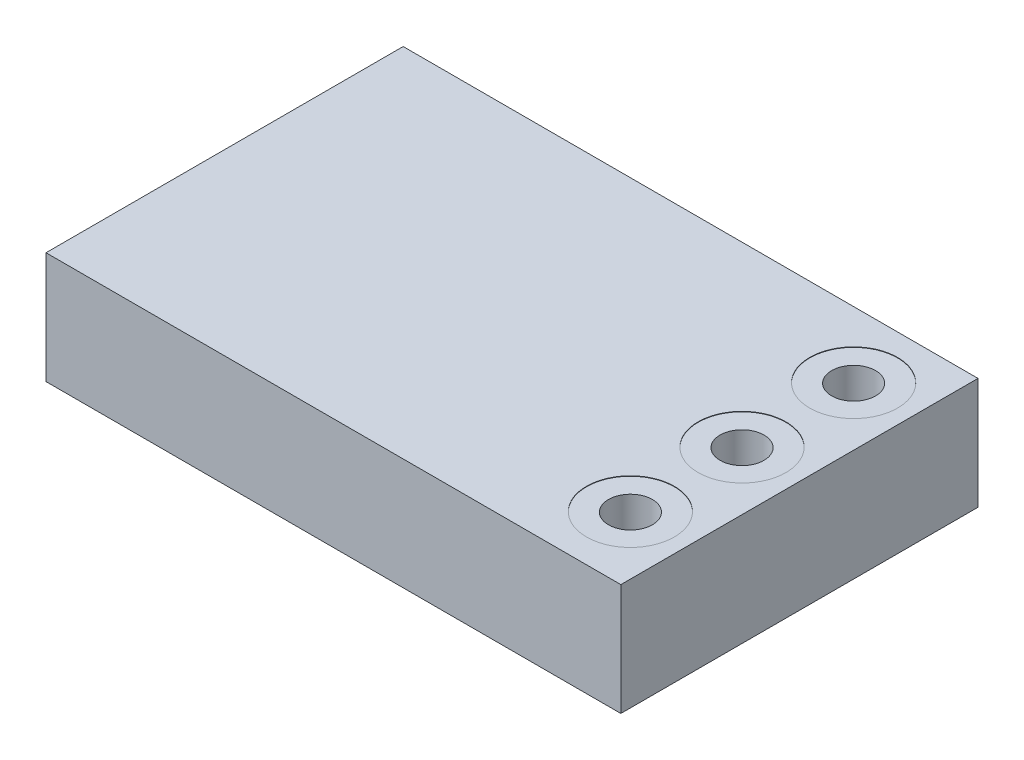
ISO-10303-21;
HEADER;
FILE_DESCRIPTION(('STEP AP214'),'2;1');
FILE_NAME('part.step','',(''),(''),'','','');
FILE_SCHEMA(('AUTOMOTIVE_DESIGN { 1 0 10303 214 1 1 1 1 }'));
ENDSEC;
DATA;
#1=APPLICATION_CONTEXT('core data for automotive mechanical design processes');
#2=APPLICATION_PROTOCOL_DEFINITION('international standard','automotive_design',2000,#1);
#3=PRODUCT_CONTEXT('',#1,'mechanical');
#4=PRODUCT('Part','Part','',(#3));
#5=PRODUCT_RELATED_PRODUCT_CATEGORY('part','',(#4));
#6=PRODUCT_DEFINITION_FORMATION('','',#4);
#7=PRODUCT_DEFINITION_CONTEXT('part definition',#1,'design');
#8=PRODUCT_DEFINITION('design','',#6,#7);
#9=PRODUCT_DEFINITION_SHAPE('','',#8);
#10=(LENGTH_UNIT() NAMED_UNIT(*) SI_UNIT(.MILLI.,.METRE.));
#11=(NAMED_UNIT(*) PLANE_ANGLE_UNIT() SI_UNIT($,.RADIAN.));
#12=(NAMED_UNIT(*) SI_UNIT($,.STERADIAN.) SOLID_ANGLE_UNIT());
#13=UNCERTAINTY_MEASURE_WITH_UNIT(LENGTH_MEASURE(1.E-05),#10,'distance_accuracy_value','');
#14=(GEOMETRIC_REPRESENTATION_CONTEXT(3) GLOBAL_UNCERTAINTY_ASSIGNED_CONTEXT((#13)) GLOBAL_UNIT_ASSIGNED_CONTEXT((#10,
#11,#12)) REPRESENTATION_CONTEXT('',''));
#15=CARTESIAN_POINT('',(0.,0.,0.));
#16=DIRECTION('',(0.,0.,1.));
#17=DIRECTION('',(1.,0.,0.));
#18=AXIS2_PLACEMENT_3D('',#15,#16,#17);
#19=CARTESIAN_POINT('',(5.2112978071614,0.,2.51672815499874));
#20=DIRECTION('',(0.,1.,0.));
#21=DIRECTION('',(0.,0.,1.));
#22=AXIS2_PLACEMENT_3D('',#19,#20,#21);
#23=CYLINDRICAL_SURFACE('',#22,0.500000000000001);
#24=CARTESIAN_POINT('',(5.2112978071614,0.,2.51672815499874));
#25=DIRECTION('',(0.,1.,0.));
#26=DIRECTION('',(0.,0.,1.));
#27=AXIS2_PLACEMENT_3D('',#24,#25,#26);
#28=CIRCLE('',#27,0.500000000000001);
#29=CARTESIAN_POINT('',(5.2112978071614,0.,3.01672815499874));
#30=VERTEX_POINT('',#29);
#31=EDGE_CURVE('E115',#30,#30,#28,.T.);
#32=ORIENTED_EDGE('',*,*,#31,.F.);
#33=EDGE_LOOP('',(#32));
#34=FACE_BOUND('',#33,.T.);
#35=CARTESIAN_POINT('',(5.2112978071614,2.53,2.51672815499874));
#36=DIRECTION('',(0.,1.,0.));
#37=DIRECTION('',(0.,0.,1.));
#38=AXIS2_PLACEMENT_3D('',#35,#36,#37);
#39=CIRCLE('',#38,0.500000000000001);
#40=CARTESIAN_POINT('',(5.2112978071614,2.53,3.01672815499874));
#41=VERTEX_POINT('',#40);
#42=EDGE_CURVE('E41',#41,#41,#39,.F.);
#43=ORIENTED_EDGE('',*,*,#42,.F.);
#44=EDGE_LOOP('',(#43));
#45=FACE_BOUND('',#44,.T.);
#46=ADVANCED_FACE('F37',(#34,#45),#23,.F.);
#47=CARTESIAN_POINT('',(5.2112978071614,0.,-0.0232718450012578));
#48=DIRECTION('',(0.,1.,0.));
#49=DIRECTION('',(0.,0.,1.));
#50=AXIS2_PLACEMENT_3D('',#47,#48,#49);
#51=CYLINDRICAL_SURFACE('',#50,0.500000000000001);
#52=CARTESIAN_POINT('',(5.2112978071614,0.,-0.0232718450012578));
#53=DIRECTION('',(0.,1.,0.));
#54=DIRECTION('',(0.,0.,1.));
#55=AXIS2_PLACEMENT_3D('',#52,#53,#54);
#56=CIRCLE('',#55,0.500000000000001);
#57=CARTESIAN_POINT('',(5.2112978071614,0.,0.476728154998743));
#58=VERTEX_POINT('',#57);
#59=EDGE_CURVE('E140',#58,#58,#56,.T.);
#60=ORIENTED_EDGE('',*,*,#59,.F.);
#61=EDGE_LOOP('',(#60));
#62=FACE_BOUND('',#61,.T.);
#63=CARTESIAN_POINT('',(5.2112978071614,2.53,-0.0232718450012578));
#64=DIRECTION('',(0.,1.,0.));
#65=DIRECTION('',(0.,0.,1.));
#66=AXIS2_PLACEMENT_3D('',#63,#64,#65);
#67=CIRCLE('',#66,0.500000000000001);
#68=CARTESIAN_POINT('',(5.2112978071614,2.53,0.476728154998743));
#69=VERTEX_POINT('',#68);
#70=EDGE_CURVE('E117',#69,#69,#67,.F.);
#71=ORIENTED_EDGE('',*,*,#70,.F.);
#72=EDGE_LOOP('',(#71));
#73=FACE_BOUND('',#72,.T.);
#74=ADVANCED_FACE('F152',(#62,#73),#51,.F.);
#75=CARTESIAN_POINT('',(5.2112978071614,0.,-2.56327184500126));
#76=DIRECTION('',(0.,1.,0.));
#77=DIRECTION('',(0.,0.,1.));
#78=AXIS2_PLACEMENT_3D('',#75,#76,#77);
#79=CYLINDRICAL_SURFACE('',#78,0.500000000000001);
#80=CARTESIAN_POINT('',(5.2112978071614,0.,-2.56327184500126));
#81=DIRECTION('',(0.,1.,0.));
#82=DIRECTION('',(0.,0.,1.));
#83=AXIS2_PLACEMENT_3D('',#80,#81,#82);
#84=CIRCLE('',#83,0.500000000000001);
#85=CARTESIAN_POINT('',(5.2112978071614,0.,-2.06327184500126));
#86=VERTEX_POINT('',#85);
#87=EDGE_CURVE('E107',#86,#86,#84,.T.);
#88=ORIENTED_EDGE('',*,*,#87,.F.);
#89=EDGE_LOOP('',(#88));
#90=FACE_BOUND('',#89,.T.);
#91=CARTESIAN_POINT('',(5.2112978071614,2.53,-2.56327184500126));
#92=DIRECTION('',(0.,1.,0.));
#93=DIRECTION('',(0.,0.,1.));
#94=AXIS2_PLACEMENT_3D('',#91,#92,#93);
#95=CIRCLE('',#94,0.500000000000001);
#96=CARTESIAN_POINT('',(5.2112978071614,2.53,-2.06327184500126));
#97=VERTEX_POINT('',#96);
#98=EDGE_CURVE('E113',#97,#97,#95,.F.);
#99=ORIENTED_EDGE('',*,*,#98,.F.);
#100=EDGE_LOOP('',(#99));
#101=FACE_BOUND('',#100,.T.);
#102=ADVANCED_FACE('F149',(#90,#101),#79,.F.);
#103=CARTESIAN_POINT('',(6.5405,2.54,4.064));
#104=DIRECTION('',(-1.,0.,0.));
#105=DIRECTION('',(0.,0.,1.));
#106=AXIS2_PLACEMENT_3D('',#103,#104,#105);
#107=PLANE('',#106);
#108=DIRECTION('',(0.,0.,-1.));
#109=VECTOR('',#108,1.);
#110=CARTESIAN_POINT('',(6.5405,0.,4.064));
#111=LINE('',#110,#109);
#112=CARTESIAN_POINT('',(6.5405,0.,4.064));
#113=VERTEX_POINT('',#112);
#114=CARTESIAN_POINT('',(6.5405,0.,-4.064));
#115=VERTEX_POINT('',#114);
#116=EDGE_CURVE('E104',#113,#115,#111,.T.);
#117=ORIENTED_EDGE('',*,*,#116,.T.);
#118=DIRECTION('',(0.,-1.,0.));
#119=VECTOR('',#118,1.);
#120=CARTESIAN_POINT('',(6.5405,2.54,-4.064));
#121=LINE('',#120,#119);
#122=CARTESIAN_POINT('',(6.5405,2.54,-4.064));
#123=VERTEX_POINT('',#122);
#124=EDGE_CURVE('E11',#123,#115,#121,.T.);
#125=ORIENTED_EDGE('',*,*,#124,.F.);
#126=DIRECTION('',(0.,0.,-1.));
#127=VECTOR('',#126,1.);
#128=CARTESIAN_POINT('',(6.5405,2.54,4.064));
#129=LINE('',#128,#127);
#130=CARTESIAN_POINT('',(6.5405,2.54,4.064));
#131=VERTEX_POINT('',#130);
#132=EDGE_CURVE('E91',#131,#123,#129,.T.);
#133=ORIENTED_EDGE('',*,*,#132,.F.);
#134=DIRECTION('',(0.,-1.,0.));
#135=VECTOR('',#134,1.);
#136=CARTESIAN_POINT('',(6.5405,2.54,4.064));
#137=LINE('',#136,#135);
#138=EDGE_CURVE('E100',#131,#113,#137,.T.);
#139=ORIENTED_EDGE('',*,*,#138,.T.);
#140=EDGE_LOOP('',(#117,#125,#133,#139));
#141=FACE_BOUND('',#140,.T.);
#142=ADVANCED_FACE('F39',(#141),#107,.F.);
#143=CARTESIAN_POINT('',(-6.5405,2.54,-4.064));
#144=DIRECTION('',(0.,0.,1.));
#145=DIRECTION('',(1.,0.,0.));
#146=AXIS2_PLACEMENT_3D('',#143,#144,#145);
#147=PLANE('',#146);
#148=DIRECTION('',(-1.,0.,0.));
#149=VECTOR('',#148,1.);
#150=CARTESIAN_POINT('',(-6.5405,0.,-4.064));
#151=LINE('',#150,#149);
#152=CARTESIAN_POINT('',(-6.5405,0.,-4.064));
#153=VERTEX_POINT('',#152);
#154=EDGE_CURVE('E95',#115,#153,#151,.T.);
#155=ORIENTED_EDGE('',*,*,#154,.T.);
#156=DIRECTION('',(0.,-1.,0.));
#157=VECTOR('',#156,1.);
#158=CARTESIAN_POINT('',(-6.5405,2.54,-4.064));
#159=LINE('',#158,#157);
#160=CARTESIAN_POINT('',(-6.5405,2.54,-4.064));
#161=VERTEX_POINT('',#160);
#162=EDGE_CURVE('E47',#161,#153,#159,.T.);
#163=ORIENTED_EDGE('',*,*,#162,.F.);
#164=DIRECTION('',(-1.,0.,0.));
#165=VECTOR('',#164,1.);
#166=CARTESIAN_POINT('',(-6.5405,2.54,-4.064));
#167=LINE('',#166,#165);
#168=EDGE_CURVE('E86',#123,#161,#167,.T.);
#169=ORIENTED_EDGE('',*,*,#168,.F.);
#170=ORIENTED_EDGE('',*,*,#124,.T.);
#171=EDGE_LOOP('',(#155,#163,#169,#170));
#172=FACE_BOUND('',#171,.T.);
#173=ADVANCED_FACE('F94',(#172),#147,.F.);
#174=CARTESIAN_POINT('',(-6.5405,2.54,4.064));
#175=DIRECTION('',(1.,0.,0.));
#176=DIRECTION('',(0.,0.,-1.));
#177=AXIS2_PLACEMENT_3D('',#174,#175,#176);
#178=PLANE('',#177);
#179=DIRECTION('',(0.,0.,1.));
#180=VECTOR('',#179,1.);
#181=CARTESIAN_POINT('',(-6.5405,0.,4.064));
#182=LINE('',#181,#180);
#183=CARTESIAN_POINT('',(-6.5405,0.,4.064));
#184=VERTEX_POINT('',#183);
#185=EDGE_CURVE('E73',#153,#184,#182,.T.);
#186=ORIENTED_EDGE('',*,*,#185,.T.);
#187=DIRECTION('',(0.,-1.,0.));
#188=VECTOR('',#187,1.);
#189=CARTESIAN_POINT('',(-6.5405,2.54,4.064));
#190=LINE('',#189,#188);
#191=CARTESIAN_POINT('',(-6.5405,2.54,4.064));
#192=VERTEX_POINT('',#191);
#193=EDGE_CURVE('E96',#192,#184,#190,.T.);
#194=ORIENTED_EDGE('',*,*,#193,.F.);
#195=DIRECTION('',(0.,0.,1.));
#196=VECTOR('',#195,1.);
#197=CARTESIAN_POINT('',(-6.5405,2.54,4.064));
#198=LINE('',#197,#196);
#199=EDGE_CURVE('E89',#161,#192,#198,.T.);
#200=ORIENTED_EDGE('',*,*,#199,.F.);
#201=ORIENTED_EDGE('',*,*,#162,.T.);
#202=EDGE_LOOP('',(#186,#194,#200,#201));
#203=FACE_BOUND('',#202,.T.);
#204=ADVANCED_FACE('F98',(#203),#178,.F.);
#205=CARTESIAN_POINT('',(-6.5405,2.54,4.064));
#206=DIRECTION('',(0.,0.,-1.));
#207=DIRECTION('',(-1.,0.,0.));
#208=AXIS2_PLACEMENT_3D('',#205,#206,#207);
#209=PLANE('',#208);
#210=DIRECTION('',(1.,0.,0.));
#211=VECTOR('',#210,1.);
#212=CARTESIAN_POINT('',(-6.5405,0.,4.064));
#213=LINE('',#212,#211);
#214=EDGE_CURVE('E79',#184,#113,#213,.T.);
#215=ORIENTED_EDGE('',*,*,#214,.T.);
#216=ORIENTED_EDGE('',*,*,#138,.F.);
#217=DIRECTION('',(1.,0.,0.));
#218=VECTOR('',#217,1.);
#219=CARTESIAN_POINT('',(-6.5405,2.54,4.064));
#220=LINE('',#219,#218);
#221=EDGE_CURVE('E56',#192,#131,#220,.T.);
#222=ORIENTED_EDGE('',*,*,#221,.F.);
#223=ORIENTED_EDGE('',*,*,#193,.T.);
#224=EDGE_LOOP('',(#215,#216,#222,#223));
#225=FACE_BOUND('',#224,.T.);
#226=ADVANCED_FACE('F184',(#225),#209,.F.);
#227=CARTESIAN_POINT('',(0.,2.54,0.));
#228=DIRECTION('',(0.,-1.,0.));
#229=DIRECTION('',(0.,0.,-1.));
#230=AXIS2_PLACEMENT_3D('',#227,#228,#229);
#231=PLANE('',#230);
#232=CARTESIAN_POINT('',(5.2112978071614,2.54,2.51672815499874));
#233=DIRECTION('',(0.,1.,0.));
#234=DIRECTION('',(0.,0.,1.));
#235=AXIS2_PLACEMENT_3D('',#232,#233,#234);
#236=CIRCLE('',#235,1.);
#237=CARTESIAN_POINT('',(5.2112978071614,2.54,3.51672815499874));
#238=VERTEX_POINT('',#237);
#239=EDGE_CURVE('E133',#238,#238,#236,.T.);
#240=ORIENTED_EDGE('',*,*,#239,.F.);
#241=EDGE_LOOP('',(#240));
#242=FACE_BOUND('',#241,.T.);
#243=CARTESIAN_POINT('',(5.2112978071614,2.54,-0.0232718450012578));
#244=DIRECTION('',(0.,1.,0.));
#245=DIRECTION('',(0.,0.,1.));
#246=AXIS2_PLACEMENT_3D('',#243,#244,#245);
#247=CIRCLE('',#246,1.);
#248=CARTESIAN_POINT('',(5.2112978071614,2.54,0.976728154998742));
#249=VERTEX_POINT('',#248);
#250=EDGE_CURVE('E126',#249,#249,#247,.T.);
#251=ORIENTED_EDGE('',*,*,#250,.F.);
#252=EDGE_LOOP('',(#251));
#253=FACE_BOUND('',#252,.T.);
#254=CARTESIAN_POINT('',(5.2112978071614,2.54,-2.56327184500126));
#255=DIRECTION('',(0.,1.,0.));
#256=DIRECTION('',(0.,0.,1.));
#257=AXIS2_PLACEMENT_3D('',#254,#255,#256);
#258=CIRCLE('',#257,1.);
#259=CARTESIAN_POINT('',(5.2112978071614,2.54,-1.56327184500126));
#260=VERTEX_POINT('',#259);
#261=EDGE_CURVE('E119',#260,#260,#258,.T.);
#262=ORIENTED_EDGE('',*,*,#261,.F.);
#263=EDGE_LOOP('',(#262));
#264=FACE_BOUND('',#263,.T.);
#265=ORIENTED_EDGE('',*,*,#132,.T.);
#266=ORIENTED_EDGE('',*,*,#168,.T.);
#267=ORIENTED_EDGE('',*,*,#199,.T.);
#268=ORIENTED_EDGE('',*,*,#221,.T.);
#269=EDGE_LOOP('',(#265,#266,#267,#268));
#270=FACE_BOUND('',#269,.T.);
#271=ADVANCED_FACE('F87',(#242,#253,#264,#270),#231,.F.);
#272=CARTESIAN_POINT('',(0.,0.,0.));
#273=DIRECTION('',(0.,-1.,0.));
#274=DIRECTION('',(0.,0.,-1.));
#275=AXIS2_PLACEMENT_3D('',#272,#273,#274);
#276=PLANE('',#275);
#277=ORIENTED_EDGE('',*,*,#31,.T.);
#278=EDGE_LOOP('',(#277));
#279=FACE_BOUND('',#278,.T.);
#280=ORIENTED_EDGE('',*,*,#59,.T.);
#281=EDGE_LOOP('',(#280));
#282=FACE_BOUND('',#281,.T.);
#283=ORIENTED_EDGE('',*,*,#87,.T.);
#284=EDGE_LOOP('',(#283));
#285=FACE_BOUND('',#284,.T.);
#286=ORIENTED_EDGE('',*,*,#116,.F.);
#287=ORIENTED_EDGE('',*,*,#214,.F.);
#288=ORIENTED_EDGE('',*,*,#185,.F.);
#289=ORIENTED_EDGE('',*,*,#154,.F.);
#290=EDGE_LOOP('',(#286,#287,#288,#289));
#291=FACE_BOUND('',#290,.T.);
#292=ADVANCED_FACE('F146',(#279,#282,#285,#291),#276,.T.);
#293=CARTESIAN_POINT('',(5.2112978071614,2.53,-2.56327184500126));
#294=DIRECTION('',(0.,1.,0.));
#295=DIRECTION('',(0.,0.,1.));
#296=AXIS2_PLACEMENT_3D('',#293,#294,#295);
#297=PLANE('',#296);
#298=CARTESIAN_POINT('',(5.2112978071614,2.53,-2.56327184500126));
#299=DIRECTION('',(0.,1.,0.));
#300=DIRECTION('',(0.,0.,1.));
#301=AXIS2_PLACEMENT_3D('',#298,#299,#300);
#302=CIRCLE('',#301,1.);
#303=CARTESIAN_POINT('',(5.2112978071614,2.53,-1.56327184500126));
#304=VERTEX_POINT('',#303);
#305=EDGE_CURVE('E116',#304,#304,#302,.T.);
#306=ORIENTED_EDGE('',*,*,#305,.T.);
#307=EDGE_LOOP('',(#306));
#308=FACE_BOUND('',#307,.T.);
#309=ORIENTED_EDGE('',*,*,#98,.T.);
#310=EDGE_LOOP('',(#309));
#311=FACE_BOUND('',#310,.T.);
#312=ADVANCED_FACE('F156',(#308,#311),#297,.T.);
#313=CARTESIAN_POINT('',(5.2112978071614,2.53,-2.56327184500126));
#314=DIRECTION('',(0.,1.,0.));
#315=DIRECTION('',(0.,0.,1.));
#316=AXIS2_PLACEMENT_3D('',#313,#314,#315);
#317=CYLINDRICAL_SURFACE('',#316,1.);
#318=CARTESIAN_POINT('',(5.2112978071614,2.53,-1.56327184500126));
#319=CARTESIAN_POINT('',(5.2112978071614,2.53010416666667,-1.56327184500126));
#320=CARTESIAN_POINT('',(5.2112978071614,2.53020833333333,-1.56327184500126));
#321=CARTESIAN_POINT('',(5.2112978071614,2.53041666666667,-1.56327184500126));
#322=CARTESIAN_POINT('',(5.2112978071614,2.53052083333333,-1.56327184500126));
#323=CARTESIAN_POINT('',(5.2112978071614,2.53072916666667,-1.56327184500126));
#324=CARTESIAN_POINT('',(5.2112978071614,2.53083333333333,-1.56327184500126));
#325=CARTESIAN_POINT('',(5.2112978071614,2.53104166666667,-1.56327184500126));
#326=CARTESIAN_POINT('',(5.2112978071614,2.53114583333333,-1.56327184500126));
#327=CARTESIAN_POINT('',(5.2112978071614,2.53135416666667,-1.56327184500126));
#328=CARTESIAN_POINT('',(5.2112978071614,2.53145833333333,-1.56327184500126));
#329=CARTESIAN_POINT('',(5.2112978071614,2.53166666666667,-1.56327184500126));
#330=CARTESIAN_POINT('',(5.2112978071614,2.53177083333333,-1.56327184500126));
#331=CARTESIAN_POINT('',(5.2112978071614,2.53197916666667,-1.56327184500126));
#332=CARTESIAN_POINT('',(5.2112978071614,2.53208333333333,-1.56327184500126));
#333=CARTESIAN_POINT('',(5.2112978071614,2.53229166666667,-1.56327184500126));
#334=CARTESIAN_POINT('',(5.2112978071614,2.53239583333333,-1.56327184500126));
#335=CARTESIAN_POINT('',(5.2112978071614,2.53260416666667,-1.56327184500126));
#336=CARTESIAN_POINT('',(5.2112978071614,2.53270833333333,-1.56327184500126));
#337=CARTESIAN_POINT('',(5.2112978071614,2.53291666666667,-1.56327184500126));
#338=CARTESIAN_POINT('',(5.2112978071614,2.53302083333333,-1.56327184500126));
#339=CARTESIAN_POINT('',(5.2112978071614,2.53322916666667,-1.56327184500126));
#340=CARTESIAN_POINT('',(5.2112978071614,2.53333333333333,-1.56327184500126));
#341=CARTESIAN_POINT('',(5.2112978071614,2.53354166666667,-1.56327184500126));
#342=CARTESIAN_POINT('',(5.2112978071614,2.53364583333333,-1.56327184500126));
#343=CARTESIAN_POINT('',(5.2112978071614,2.53385416666667,-1.56327184500126));
#344=CARTESIAN_POINT('',(5.2112978071614,2.53395833333333,-1.56327184500126));
#345=CARTESIAN_POINT('',(5.2112978071614,2.53416666666667,-1.56327184500126));
#346=CARTESIAN_POINT('',(5.2112978071614,2.53427083333333,-1.56327184500126));
#347=CARTESIAN_POINT('',(5.2112978071614,2.53447916666667,-1.56327184500126));
#348=CARTESIAN_POINT('',(5.2112978071614,2.53458333333333,-1.56327184500126));
#349=CARTESIAN_POINT('',(5.2112978071614,2.53479166666667,-1.56327184500126));
#350=CARTESIAN_POINT('',(5.2112978071614,2.53489583333333,-1.56327184500126));
#351=CARTESIAN_POINT('',(5.2112978071614,2.53510416666667,-1.56327184500126));
#352=CARTESIAN_POINT('',(5.2112978071614,2.53520833333333,-1.56327184500126));
#353=CARTESIAN_POINT('',(5.2112978071614,2.53541666666667,-1.56327184500126));
#354=CARTESIAN_POINT('',(5.2112978071614,2.53552083333333,-1.56327184500126));
#355=CARTESIAN_POINT('',(5.2112978071614,2.53572916666667,-1.56327184500126));
#356=CARTESIAN_POINT('',(5.2112978071614,2.53583333333333,-1.56327184500126));
#357=CARTESIAN_POINT('',(5.2112978071614,2.53604166666667,-1.56327184500126));
#358=CARTESIAN_POINT('',(5.2112978071614,2.53614583333333,-1.56327184500126));
#359=CARTESIAN_POINT('',(5.2112978071614,2.53635416666667,-1.56327184500126));
#360=CARTESIAN_POINT('',(5.2112978071614,2.53645833333333,-1.56327184500126));
#361=CARTESIAN_POINT('',(5.2112978071614,2.53666666666667,-1.56327184500126));
#362=CARTESIAN_POINT('',(5.2112978071614,2.53677083333333,-1.56327184500126));
#363=CARTESIAN_POINT('',(5.2112978071614,2.53697916666667,-1.56327184500126));
#364=CARTESIAN_POINT('',(5.2112978071614,2.53708333333333,-1.56327184500126));
#365=CARTESIAN_POINT('',(5.2112978071614,2.53729166666667,-1.56327184500126));
#366=CARTESIAN_POINT('',(5.2112978071614,2.53739583333333,-1.56327184500126));
#367=CARTESIAN_POINT('',(5.2112978071614,2.53760416666667,-1.56327184500126));
#368=CARTESIAN_POINT('',(5.2112978071614,2.53770833333333,-1.56327184500126));
#369=CARTESIAN_POINT('',(5.2112978071614,2.53791666666667,-1.56327184500126));
#370=CARTESIAN_POINT('',(5.2112978071614,2.53802083333333,-1.56327184500126));
#371=CARTESIAN_POINT('',(5.2112978071614,2.53822916666667,-1.56327184500126));
#372=CARTESIAN_POINT('',(5.2112978071614,2.53833333333333,-1.56327184500126));
#373=CARTESIAN_POINT('',(5.2112978071614,2.53854166666667,-1.56327184500126));
#374=CARTESIAN_POINT('',(5.2112978071614,2.53864583333333,-1.56327184500126));
#375=CARTESIAN_POINT('',(5.2112978071614,2.53885416666667,-1.56327184500126));
#376=CARTESIAN_POINT('',(5.2112978071614,2.53895833333333,-1.56327184500126));
#377=CARTESIAN_POINT('',(5.2112978071614,2.53916666666667,-1.56327184500126));
#378=CARTESIAN_POINT('',(5.2112978071614,2.53927083333333,-1.56327184500126));
#379=CARTESIAN_POINT('',(5.2112978071614,2.53947916666667,-1.56327184500126));
#380=CARTESIAN_POINT('',(5.2112978071614,2.53958333333333,-1.56327184500126));
#381=CARTESIAN_POINT('',(5.2112978071614,2.53979166666667,-1.56327184500126));
#382=CARTESIAN_POINT('',(5.2112978071614,2.53989583333333,-1.56327184500126));
#383=CARTESIAN_POINT('',(5.2112978071614,2.54,-1.56327184500126));
#384=B_SPLINE_CURVE_WITH_KNOTS('',3,(#318,#319,#320,#321,#322,#323,#324,#325,#326,#327,#328,
#329,#330,#331,#332,#333,#334,#335,#336,#337,#338,#339,#340,#341,#342,#343,#344,#345,#346,#347,
#348,#349,#350,#351,#352,#353,#354,#355,#356,#357,#358,#359,#360,#361,#362,#363,#364,#365,#366,
#367,#368,#369,#370,#371,#372,#373,#374,#375,#376,#377,#378,#379,#380,#381,#382,#383),
.UNSPECIFIED.,.F.,.F.,(4,2,2,2,2,2,2,2,2,2,2,2,2,2,2,2,2,2,2,2,2,2,2,2,2,2,2,2,2,2,2,2,4),(0.,
0.000312499999999879,0.000624999999999758,0.000937499999999637,0.00124999999999995,
0.00156249999999983,0.00187499999999971,0.00218749999999959,0.0024999999999999,
0.00281249999999978,0.00312499999999966,0.00343749999999997,0.00374999999999985,
0.00406249999999973,0.0043749999999996,0.00468749999999992,0.0049999999999998,
0.00531249999999968,0.00562499999999999,0.00593749999999987,0.00624999999999975,
0.00656249999999962,0.00687499999999994,0.00718749999999982,0.00749999999999969,
0.00781250000000001,0.00812499999999989,0.00843749999999976,0.00874999999999964,
0.00906249999999996,0.00937499999999983,0.00968749999999971,0.01),.UNSPECIFIED.);
#385=EDGE_CURVE('BSEAM158',#304,#260,#384,.T.);
#386=ORIENTED_EDGE('',*,*,#305,.F.);
#387=ORIENTED_EDGE('',*,*,#261,.T.);
#388=ORIENTED_EDGE('',*,*,#385,.T.);
#389=ORIENTED_EDGE('',*,*,#385,.F.);
#390=EDGE_LOOP('',(#386,#388,#387,#389));
#391=FACE_BOUND('',#390,.T.);
#392=ADVANCED_FACE('F158',(#391),#317,.F.);
#393=CARTESIAN_POINT('',(5.2112978071614,2.53,-0.0232718450012578));
#394=DIRECTION('',(0.,1.,0.));
#395=DIRECTION('',(0.,0.,1.));
#396=AXIS2_PLACEMENT_3D('',#393,#394,#395);
#397=PLANE('',#396);
#398=CARTESIAN_POINT('',(5.2112978071614,2.53,-0.0232718450012578));
#399=DIRECTION('',(0.,1.,0.));
#400=DIRECTION('',(0.,0.,1.));
#401=AXIS2_PLACEMENT_3D('',#398,#399,#400);
#402=CIRCLE('',#401,1.);
#403=CARTESIAN_POINT('',(5.2112978071614,2.53,0.976728154998742));
#404=VERTEX_POINT('',#403);
#405=EDGE_CURVE('E120',#404,#404,#402,.T.);
#406=ORIENTED_EDGE('',*,*,#405,.T.);
#407=EDGE_LOOP('',(#406));
#408=FACE_BOUND('',#407,.T.);
#409=ORIENTED_EDGE('',*,*,#70,.T.);
#410=EDGE_LOOP('',(#409));
#411=FACE_BOUND('',#410,.T.);
#412=ADVANCED_FACE('F164',(#408,#411),#397,.T.);
#413=CARTESIAN_POINT('',(5.2112978071614,2.53,-0.0232718450012578));
#414=DIRECTION('',(0.,1.,0.));
#415=DIRECTION('',(0.,0.,1.));
#416=AXIS2_PLACEMENT_3D('',#413,#414,#415);
#417=CYLINDRICAL_SURFACE('',#416,1.);
#418=CARTESIAN_POINT('',(5.2112978071614,2.53,0.976728154998742));
#419=CARTESIAN_POINT('',(5.2112978071614,2.53010416666667,0.976728154998742));
#420=CARTESIAN_POINT('',(5.2112978071614,2.53020833333333,0.976728154998742));
#421=CARTESIAN_POINT('',(5.2112978071614,2.53041666666667,0.976728154998742));
#422=CARTESIAN_POINT('',(5.2112978071614,2.53052083333333,0.976728154998742));
#423=CARTESIAN_POINT('',(5.2112978071614,2.53072916666667,0.976728154998742));
#424=CARTESIAN_POINT('',(5.2112978071614,2.53083333333333,0.976728154998742));
#425=CARTESIAN_POINT('',(5.2112978071614,2.53104166666667,0.976728154998742));
#426=CARTESIAN_POINT('',(5.2112978071614,2.53114583333333,0.976728154998742));
#427=CARTESIAN_POINT('',(5.2112978071614,2.53135416666667,0.976728154998742));
#428=CARTESIAN_POINT('',(5.2112978071614,2.53145833333333,0.976728154998742));
#429=CARTESIAN_POINT('',(5.2112978071614,2.53166666666667,0.976728154998742));
#430=CARTESIAN_POINT('',(5.2112978071614,2.53177083333333,0.976728154998742));
#431=CARTESIAN_POINT('',(5.2112978071614,2.53197916666667,0.976728154998742));
#432=CARTESIAN_POINT('',(5.2112978071614,2.53208333333333,0.976728154998742));
#433=CARTESIAN_POINT('',(5.2112978071614,2.53229166666667,0.976728154998742));
#434=CARTESIAN_POINT('',(5.2112978071614,2.53239583333333,0.976728154998742));
#435=CARTESIAN_POINT('',(5.2112978071614,2.53260416666667,0.976728154998742));
#436=CARTESIAN_POINT('',(5.2112978071614,2.53270833333333,0.976728154998742));
#437=CARTESIAN_POINT('',(5.2112978071614,2.53291666666667,0.976728154998742));
#438=CARTESIAN_POINT('',(5.2112978071614,2.53302083333333,0.976728154998742));
#439=CARTESIAN_POINT('',(5.2112978071614,2.53322916666667,0.976728154998742));
#440=CARTESIAN_POINT('',(5.2112978071614,2.53333333333333,0.976728154998742));
#441=CARTESIAN_POINT('',(5.2112978071614,2.53354166666667,0.976728154998742));
#442=CARTESIAN_POINT('',(5.2112978071614,2.53364583333333,0.976728154998742));
#443=CARTESIAN_POINT('',(5.2112978071614,2.53385416666667,0.976728154998742));
#444=CARTESIAN_POINT('',(5.2112978071614,2.53395833333333,0.976728154998742));
#445=CARTESIAN_POINT('',(5.2112978071614,2.53416666666667,0.976728154998742));
#446=CARTESIAN_POINT('',(5.2112978071614,2.53427083333333,0.976728154998742));
#447=CARTESIAN_POINT('',(5.2112978071614,2.53447916666667,0.976728154998742));
#448=CARTESIAN_POINT('',(5.2112978071614,2.53458333333333,0.976728154998742));
#449=CARTESIAN_POINT('',(5.2112978071614,2.53479166666667,0.976728154998742));
#450=CARTESIAN_POINT('',(5.2112978071614,2.53489583333333,0.976728154998742));
#451=CARTESIAN_POINT('',(5.2112978071614,2.53510416666667,0.976728154998742));
#452=CARTESIAN_POINT('',(5.2112978071614,2.53520833333333,0.976728154998742));
#453=CARTESIAN_POINT('',(5.2112978071614,2.53541666666667,0.976728154998742));
#454=CARTESIAN_POINT('',(5.2112978071614,2.53552083333333,0.976728154998742));
#455=CARTESIAN_POINT('',(5.2112978071614,2.53572916666667,0.976728154998742));
#456=CARTESIAN_POINT('',(5.2112978071614,2.53583333333333,0.976728154998742));
#457=CARTESIAN_POINT('',(5.2112978071614,2.53604166666667,0.976728154998742));
#458=CARTESIAN_POINT('',(5.2112978071614,2.53614583333333,0.976728154998742));
#459=CARTESIAN_POINT('',(5.2112978071614,2.53635416666667,0.976728154998742));
#460=CARTESIAN_POINT('',(5.2112978071614,2.53645833333333,0.976728154998742));
#461=CARTESIAN_POINT('',(5.2112978071614,2.53666666666667,0.976728154998742));
#462=CARTESIAN_POINT('',(5.2112978071614,2.53677083333333,0.976728154998742));
#463=CARTESIAN_POINT('',(5.2112978071614,2.53697916666667,0.976728154998742));
#464=CARTESIAN_POINT('',(5.2112978071614,2.53708333333333,0.976728154998742));
#465=CARTESIAN_POINT('',(5.2112978071614,2.53729166666667,0.976728154998742));
#466=CARTESIAN_POINT('',(5.2112978071614,2.53739583333333,0.976728154998742));
#467=CARTESIAN_POINT('',(5.2112978071614,2.53760416666667,0.976728154998742));
#468=CARTESIAN_POINT('',(5.2112978071614,2.53770833333333,0.976728154998742));
#469=CARTESIAN_POINT('',(5.2112978071614,2.53791666666667,0.976728154998742));
#470=CARTESIAN_POINT('',(5.2112978071614,2.53802083333333,0.976728154998742));
#471=CARTESIAN_POINT('',(5.2112978071614,2.53822916666667,0.976728154998742));
#472=CARTESIAN_POINT('',(5.2112978071614,2.53833333333333,0.976728154998742));
#473=CARTESIAN_POINT('',(5.2112978071614,2.53854166666667,0.976728154998742));
#474=CARTESIAN_POINT('',(5.2112978071614,2.53864583333333,0.976728154998742));
#475=CARTESIAN_POINT('',(5.2112978071614,2.53885416666667,0.976728154998742));
#476=CARTESIAN_POINT('',(5.2112978071614,2.53895833333333,0.976728154998742));
#477=CARTESIAN_POINT('',(5.2112978071614,2.53916666666667,0.976728154998742));
#478=CARTESIAN_POINT('',(5.2112978071614,2.53927083333333,0.976728154998742));
#479=CARTESIAN_POINT('',(5.2112978071614,2.53947916666667,0.976728154998742));
#480=CARTESIAN_POINT('',(5.2112978071614,2.53958333333333,0.976728154998742));
#481=CARTESIAN_POINT('',(5.2112978071614,2.53979166666667,0.976728154998742));
#482=CARTESIAN_POINT('',(5.2112978071614,2.53989583333333,0.976728154998742));
#483=CARTESIAN_POINT('',(5.2112978071614,2.54,0.976728154998742));
#484=B_SPLINE_CURVE_WITH_KNOTS('',3,(#418,#419,#420,#421,#422,#423,#424,#425,#426,#427,#428,
#429,#430,#431,#432,#433,#434,#435,#436,#437,#438,#439,#440,#441,#442,#443,#444,#445,#446,#447,
#448,#449,#450,#451,#452,#453,#454,#455,#456,#457,#458,#459,#460,#461,#462,#463,#464,#465,#466,
#467,#468,#469,#470,#471,#472,#473,#474,#475,#476,#477,#478,#479,#480,#481,#482,#483),
.UNSPECIFIED.,.F.,.F.,(4,2,2,2,2,2,2,2,2,2,2,2,2,2,2,2,2,2,2,2,2,2,2,2,2,2,2,2,2,2,2,2,4),(0.,
0.000312499999999879,0.000624999999999758,0.000937499999999637,0.00124999999999995,
0.00156249999999983,0.00187499999999971,0.00218749999999959,0.0024999999999999,
0.00281249999999978,0.00312499999999966,0.00343749999999997,0.00374999999999985,
0.00406249999999973,0.0043749999999996,0.00468749999999992,0.0049999999999998,
0.00531249999999968,0.00562499999999999,0.00593749999999987,0.00624999999999975,
0.00656249999999962,0.00687499999999994,0.00718749999999982,0.00749999999999969,
0.00781250000000001,0.00812499999999989,0.00843749999999976,0.00874999999999964,
0.00906249999999996,0.00937499999999983,0.00968749999999971,0.01),.UNSPECIFIED.);
#485=EDGE_CURVE('BSEAM256',#404,#249,#484,.T.);
#486=ORIENTED_EDGE('',*,*,#405,.F.);
#487=ORIENTED_EDGE('',*,*,#250,.T.);
#488=ORIENTED_EDGE('',*,*,#485,.T.);
#489=ORIENTED_EDGE('',*,*,#485,.F.);
#490=EDGE_LOOP('',(#486,#488,#487,#489));
#491=FACE_BOUND('',#490,.T.);
#492=ADVANCED_FACE('F256',(#491),#417,.F.);
#493=CARTESIAN_POINT('',(5.2112978071614,2.53,2.51672815499874));
#494=DIRECTION('',(0.,1.,0.));
#495=DIRECTION('',(0.,0.,1.));
#496=AXIS2_PLACEMENT_3D('',#493,#494,#495);
#497=PLANE('',#496);
#498=CARTESIAN_POINT('',(5.2112978071614,2.53,2.51672815499874));
#499=DIRECTION('',(0.,1.,0.));
#500=DIRECTION('',(0.,0.,1.));
#501=AXIS2_PLACEMENT_3D('',#498,#499,#500);
#502=CIRCLE('',#501,1.);
#503=CARTESIAN_POINT('',(5.2112978071614,2.53,3.51672815499874));
#504=VERTEX_POINT('',#503);
#505=EDGE_CURVE('E291',#504,#504,#502,.T.);
#506=ORIENTED_EDGE('',*,*,#505,.T.);
#507=EDGE_LOOP('',(#506));
#508=FACE_BOUND('',#507,.T.);
#509=ORIENTED_EDGE('',*,*,#42,.T.);
#510=EDGE_LOOP('',(#509));
#511=FACE_BOUND('',#510,.T.);
#512=ADVANCED_FACE('F265',(#508,#511),#497,.T.);
#513=CARTESIAN_POINT('',(5.2112978071614,2.53,2.51672815499874));
#514=DIRECTION('',(0.,1.,0.));
#515=DIRECTION('',(0.,0.,1.));
#516=AXIS2_PLACEMENT_3D('',#513,#514,#515);
#517=CYLINDRICAL_SURFACE('',#516,1.);
#518=CARTESIAN_POINT('',(5.2112978071614,2.53,3.51672815499874));
#519=CARTESIAN_POINT('',(5.2112978071614,2.53010416666667,3.51672815499874));
#520=CARTESIAN_POINT('',(5.2112978071614,2.53020833333333,3.51672815499874));
#521=CARTESIAN_POINT('',(5.2112978071614,2.53041666666667,3.51672815499874));
#522=CARTESIAN_POINT('',(5.2112978071614,2.53052083333333,3.51672815499874));
#523=CARTESIAN_POINT('',(5.2112978071614,2.53072916666667,3.51672815499874));
#524=CARTESIAN_POINT('',(5.2112978071614,2.53083333333333,3.51672815499874));
#525=CARTESIAN_POINT('',(5.2112978071614,2.53104166666667,3.51672815499874));
#526=CARTESIAN_POINT('',(5.2112978071614,2.53114583333333,3.51672815499874));
#527=CARTESIAN_POINT('',(5.2112978071614,2.53135416666667,3.51672815499874));
#528=CARTESIAN_POINT('',(5.2112978071614,2.53145833333333,3.51672815499874));
#529=CARTESIAN_POINT('',(5.2112978071614,2.53166666666667,3.51672815499874));
#530=CARTESIAN_POINT('',(5.2112978071614,2.53177083333333,3.51672815499874));
#531=CARTESIAN_POINT('',(5.2112978071614,2.53197916666667,3.51672815499874));
#532=CARTESIAN_POINT('',(5.2112978071614,2.53208333333333,3.51672815499874));
#533=CARTESIAN_POINT('',(5.2112978071614,2.53229166666667,3.51672815499874));
#534=CARTESIAN_POINT('',(5.2112978071614,2.53239583333333,3.51672815499874));
#535=CARTESIAN_POINT('',(5.2112978071614,2.53260416666667,3.51672815499874));
#536=CARTESIAN_POINT('',(5.2112978071614,2.53270833333333,3.51672815499874));
#537=CARTESIAN_POINT('',(5.2112978071614,2.53291666666667,3.51672815499874));
#538=CARTESIAN_POINT('',(5.2112978071614,2.53302083333333,3.51672815499874));
#539=CARTESIAN_POINT('',(5.2112978071614,2.53322916666667,3.51672815499874));
#540=CARTESIAN_POINT('',(5.2112978071614,2.53333333333333,3.51672815499874));
#541=CARTESIAN_POINT('',(5.2112978071614,2.53354166666667,3.51672815499874));
#542=CARTESIAN_POINT('',(5.2112978071614,2.53364583333333,3.51672815499874));
#543=CARTESIAN_POINT('',(5.2112978071614,2.53385416666667,3.51672815499874));
#544=CARTESIAN_POINT('',(5.2112978071614,2.53395833333333,3.51672815499874));
#545=CARTESIAN_POINT('',(5.2112978071614,2.53416666666667,3.51672815499874));
#546=CARTESIAN_POINT('',(5.2112978071614,2.53427083333333,3.51672815499874));
#547=CARTESIAN_POINT('',(5.2112978071614,2.53447916666667,3.51672815499874));
#548=CARTESIAN_POINT('',(5.2112978071614,2.53458333333333,3.51672815499874));
#549=CARTESIAN_POINT('',(5.2112978071614,2.53479166666667,3.51672815499874));
#550=CARTESIAN_POINT('',(5.2112978071614,2.53489583333333,3.51672815499874));
#551=CARTESIAN_POINT('',(5.2112978071614,2.53510416666667,3.51672815499874));
#552=CARTESIAN_POINT('',(5.2112978071614,2.53520833333333,3.51672815499874));
#553=CARTESIAN_POINT('',(5.2112978071614,2.53541666666667,3.51672815499874));
#554=CARTESIAN_POINT('',(5.2112978071614,2.53552083333333,3.51672815499874));
#555=CARTESIAN_POINT('',(5.2112978071614,2.53572916666667,3.51672815499874));
#556=CARTESIAN_POINT('',(5.2112978071614,2.53583333333333,3.51672815499874));
#557=CARTESIAN_POINT('',(5.2112978071614,2.53604166666667,3.51672815499874));
#558=CARTESIAN_POINT('',(5.2112978071614,2.53614583333333,3.51672815499874));
#559=CARTESIAN_POINT('',(5.2112978071614,2.53635416666667,3.51672815499874));
#560=CARTESIAN_POINT('',(5.2112978071614,2.53645833333333,3.51672815499874));
#561=CARTESIAN_POINT('',(5.2112978071614,2.53666666666667,3.51672815499874));
#562=CARTESIAN_POINT('',(5.2112978071614,2.53677083333333,3.51672815499874));
#563=CARTESIAN_POINT('',(5.2112978071614,2.53697916666667,3.51672815499874));
#564=CARTESIAN_POINT('',(5.2112978071614,2.53708333333333,3.51672815499874));
#565=CARTESIAN_POINT('',(5.2112978071614,2.53729166666667,3.51672815499874));
#566=CARTESIAN_POINT('',(5.2112978071614,2.53739583333333,3.51672815499874));
#567=CARTESIAN_POINT('',(5.2112978071614,2.53760416666667,3.51672815499874));
#568=CARTESIAN_POINT('',(5.2112978071614,2.53770833333333,3.51672815499874));
#569=CARTESIAN_POINT('',(5.2112978071614,2.53791666666667,3.51672815499874));
#570=CARTESIAN_POINT('',(5.2112978071614,2.53802083333333,3.51672815499874));
#571=CARTESIAN_POINT('',(5.2112978071614,2.53822916666667,3.51672815499874));
#572=CARTESIAN_POINT('',(5.2112978071614,2.53833333333333,3.51672815499874));
#573=CARTESIAN_POINT('',(5.2112978071614,2.53854166666667,3.51672815499874));
#574=CARTESIAN_POINT('',(5.2112978071614,2.53864583333333,3.51672815499874));
#575=CARTESIAN_POINT('',(5.2112978071614,2.53885416666667,3.51672815499874));
#576=CARTESIAN_POINT('',(5.2112978071614,2.53895833333333,3.51672815499874));
#577=CARTESIAN_POINT('',(5.2112978071614,2.53916666666667,3.51672815499874));
#578=CARTESIAN_POINT('',(5.2112978071614,2.53927083333333,3.51672815499874));
#579=CARTESIAN_POINT('',(5.2112978071614,2.53947916666667,3.51672815499874));
#580=CARTESIAN_POINT('',(5.2112978071614,2.53958333333333,3.51672815499874));
#581=CARTESIAN_POINT('',(5.2112978071614,2.53979166666667,3.51672815499874));
#582=CARTESIAN_POINT('',(5.2112978071614,2.53989583333333,3.51672815499874));
#583=CARTESIAN_POINT('',(5.2112978071614,2.54,3.51672815499874));
#584=B_SPLINE_CURVE_WITH_KNOTS('',3,(#518,#519,#520,#521,#522,#523,#524,#525,#526,#527,#528,
#529,#530,#531,#532,#533,#534,#535,#536,#537,#538,#539,#540,#541,#542,#543,#544,#545,#546,#547,
#548,#549,#550,#551,#552,#553,#554,#555,#556,#557,#558,#559,#560,#561,#562,#563,#564,#565,#566,
#567,#568,#569,#570,#571,#572,#573,#574,#575,#576,#577,#578,#579,#580,#581,#582,#583),
.UNSPECIFIED.,.F.,.F.,(4,2,2,2,2,2,2,2,2,2,2,2,2,2,2,2,2,2,2,2,2,2,2,2,2,2,2,2,2,2,2,2,4),(0.,
0.000312499999999879,0.000624999999999758,0.000937499999999637,0.00124999999999995,
0.00156249999999983,0.00187499999999971,0.00218749999999959,0.0024999999999999,
0.00281249999999978,0.00312499999999966,0.00343749999999997,0.00374999999999985,
0.00406249999999973,0.0043749999999996,0.00468749999999992,0.0049999999999998,
0.00531249999999968,0.00562499999999999,0.00593749999999987,0.00624999999999975,
0.00656249999999962,0.00687499999999994,0.00718749999999982,0.00749999999999969,
0.00781250000000001,0.00812499999999989,0.00843749999999976,0.00874999999999964,
0.00906249999999996,0.00937499999999983,0.00968749999999971,0.01),.UNSPECIFIED.);
#585=EDGE_CURVE('BSEAM274',#504,#238,#584,.T.);
#586=ORIENTED_EDGE('',*,*,#505,.F.);
#587=ORIENTED_EDGE('',*,*,#239,.T.);
#588=ORIENTED_EDGE('',*,*,#585,.T.);
#589=ORIENTED_EDGE('',*,*,#585,.F.);
#590=EDGE_LOOP('',(#586,#588,#587,#589));
#591=FACE_BOUND('',#590,.T.);
#592=ADVANCED_FACE('F274',(#591),#517,.F.);
#593=CLOSED_SHELL('',(#46,#74,#102,#142,#173,#204,#226,#271,#292,#312,#392,#412,#492,#512,#592));
#594=MANIFOLD_SOLID_BREP('B2',#593);
#595=ADVANCED_BREP_SHAPE_REPRESENTATION('',(#18,#594),#14);
#596=SHAPE_DEFINITION_REPRESENTATION(#9,#595);
ENDSEC;
END-ISO-10303-21;
